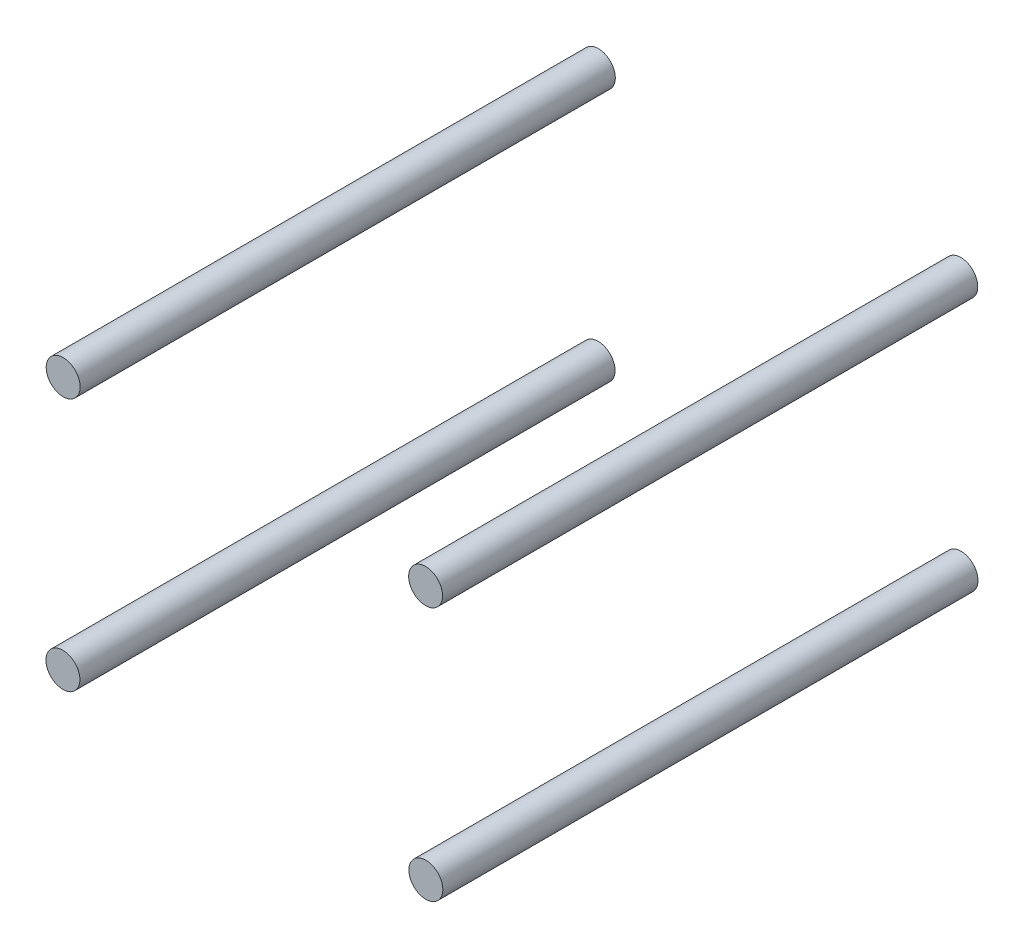
ISO-10303-21;
HEADER;
FILE_DESCRIPTION(('STEP AP214'),'2;1');
FILE_NAME('part.step','',(''),(''),'','','');
FILE_SCHEMA(('AUTOMOTIVE_DESIGN { 1 0 10303 214 1 1 1 1 }'));
ENDSEC;
DATA;
#1=APPLICATION_CONTEXT('core data for automotive mechanical design processes');
#2=APPLICATION_PROTOCOL_DEFINITION('international standard','automotive_design',2000,#1);
#3=PRODUCT_CONTEXT('',#1,'mechanical');
#4=PRODUCT('Part','Part','',(#3));
#5=PRODUCT_RELATED_PRODUCT_CATEGORY('part','',(#4));
#6=PRODUCT_DEFINITION_FORMATION('','',#4);
#7=PRODUCT_DEFINITION_CONTEXT('part definition',#1,'design');
#8=PRODUCT_DEFINITION('design','',#6,#7);
#9=PRODUCT_DEFINITION_SHAPE('','',#8);
#10=(LENGTH_UNIT() NAMED_UNIT(*) SI_UNIT(.MILLI.,.METRE.));
#11=(NAMED_UNIT(*) PLANE_ANGLE_UNIT() SI_UNIT($,.RADIAN.));
#12=(NAMED_UNIT(*) SI_UNIT($,.STERADIAN.) SOLID_ANGLE_UNIT());
#13=UNCERTAINTY_MEASURE_WITH_UNIT(LENGTH_MEASURE(1.E-05),#10,'distance_accuracy_value','');
#14=(GEOMETRIC_REPRESENTATION_CONTEXT(3) GLOBAL_UNCERTAINTY_ASSIGNED_CONTEXT((#13)) GLOBAL_UNIT_ASSIGNED_CONTEXT((#10,
#11,#12)) REPRESENTATION_CONTEXT('',''));
#15=CARTESIAN_POINT('',(0.,0.,0.));
#16=DIRECTION('',(0.,0.,1.));
#17=DIRECTION('',(1.,0.,0.));
#18=AXIS2_PLACEMENT_3D('',#15,#16,#17);
#19=CARTESIAN_POINT('',(6450.41638528545,3655.22893796991,92.11056));
#20=DIRECTION('',(0.,0.,-1.));
#21=DIRECTION('',(-1.,0.,0.));
#22=AXIS2_PLACEMENT_3D('',#19,#20,#21);
#23=CYLINDRICAL_SURFACE('',#22,2.92100002095541);
#24=CARTESIAN_POINT('',(6450.41638528545,3655.22893796991,92.11056));
#25=DIRECTION('',(0.,0.,1.));
#26=DIRECTION('',(1.,0.,0.));
#27=AXIS2_PLACEMENT_3D('',#24,#25,#26);
#28=CIRCLE('',#27,2.92100002095541);
#29=CARTESIAN_POINT('',(6453.33738530641,3655.22893796991,92.11056));
#30=VERTEX_POINT('',#29);
#31=EDGE_CURVE('E11',#30,#30,#28,.T.);
#32=ORIENTED_EDGE('',*,*,#31,.F.);
#33=EDGE_LOOP('',(#32));
#34=FACE_BOUND('',#33,.T.);
#35=CARTESIAN_POINT('',(6450.41638528545,3655.22893796991,0.));
#36=DIRECTION('',(0.,0.,1.));
#37=DIRECTION('',(1.,0.,0.));
#38=AXIS2_PLACEMENT_3D('',#35,#36,#37);
#39=CIRCLE('',#38,2.92100002095541);
#40=CARTESIAN_POINT('',(6453.33738530641,3655.22893796991,0.));
#41=VERTEX_POINT('',#40);
#42=EDGE_CURVE('E43',#41,#41,#39,.T.);
#43=ORIENTED_EDGE('',*,*,#42,.T.);
#44=EDGE_LOOP('',(#43));
#45=FACE_BOUND('',#44,.T.);
#46=ADVANCED_FACE('F40',(#34,#45),#23,.T.);
#47=CARTESIAN_POINT('',(6450.41638528545,3655.22893796991,92.11056));
#48=DIRECTION('',(0.,0.,1.));
#49=DIRECTION('',(1.,0.,0.));
#50=AXIS2_PLACEMENT_3D('',#47,#48,#49);
#51=PLANE('',#50);
#52=ORIENTED_EDGE('',*,*,#31,.T.);
#53=EDGE_LOOP('',(#52));
#54=FACE_BOUND('',#53,.T.);
#55=ADVANCED_FACE('F55',(#54),#51,.T.);
#56=CARTESIAN_POINT('',(6450.41638528545,3655.22893796991,0.));
#57=DIRECTION('',(0.,0.,1.));
#58=DIRECTION('',(1.,0.,0.));
#59=AXIS2_PLACEMENT_3D('',#56,#57,#58);
#60=PLANE('',#59);
#61=ORIENTED_EDGE('',*,*,#42,.F.);
#62=EDGE_LOOP('',(#61));
#63=FACE_BOUND('',#62,.T.);
#64=ADVANCED_FACE('F53',(#63),#60,.F.);
#65=CLOSED_SHELL('',(#46,#55,#64));
#66=MANIFOLD_SOLID_BREP('B2',#65);
#67=CARTESIAN_POINT('',(6512.79415839501,3655.28824749994,92.11056));
#68=DIRECTION('',(0.,0.,-1.));
#69=DIRECTION('',(-1.,0.,0.));
#70=AXIS2_PLACEMENT_3D('',#67,#68,#69);
#71=CYLINDRICAL_SURFACE('',#70,2.92100002095541);
#72=CARTESIAN_POINT('',(6512.79415839501,3655.28824749994,92.11056));
#73=DIRECTION('',(0.,0.,1.));
#74=DIRECTION('',(1.,0.,0.));
#75=AXIS2_PLACEMENT_3D('',#72,#73,#74);
#76=CIRCLE('',#75,2.92100002095541);
#77=CARTESIAN_POINT('',(6515.71515841596,3655.28824749994,92.11056));
#78=VERTEX_POINT('',#77);
#79=EDGE_CURVE('E39',#78,#78,#76,.T.);
#80=ORIENTED_EDGE('',*,*,#79,.F.);
#81=EDGE_LOOP('',(#80));
#82=FACE_BOUND('',#81,.T.);
#83=CARTESIAN_POINT('',(6512.79415839501,3655.28824749994,0.));
#84=DIRECTION('',(0.,0.,1.));
#85=DIRECTION('',(1.,0.,0.));
#86=AXIS2_PLACEMENT_3D('',#83,#84,#85);
#87=CIRCLE('',#86,2.92100002095541);
#88=CARTESIAN_POINT('',(6515.71515841596,3655.28824749994,0.));
#89=VERTEX_POINT('',#88);
#90=EDGE_CURVE('E92',#89,#89,#87,.T.);
#91=ORIENTED_EDGE('',*,*,#90,.T.);
#92=EDGE_LOOP('',(#91));
#93=FACE_BOUND('',#92,.T.);
#94=ADVANCED_FACE('F89',(#82,#93),#71,.T.);
#95=CARTESIAN_POINT('',(6512.79415839501,3655.28824749994,92.11056));
#96=DIRECTION('',(0.,0.,1.));
#97=DIRECTION('',(1.,0.,0.));
#98=AXIS2_PLACEMENT_3D('',#95,#96,#97);
#99=PLANE('',#98);
#100=ORIENTED_EDGE('',*,*,#79,.T.);
#101=EDGE_LOOP('',(#100));
#102=FACE_BOUND('',#101,.T.);
#103=ADVANCED_FACE('F104',(#102),#99,.T.);
#104=CARTESIAN_POINT('',(6512.79415839501,3655.28824749994,0.));
#105=DIRECTION('',(0.,0.,1.));
#106=DIRECTION('',(1.,0.,0.));
#107=AXIS2_PLACEMENT_3D('',#104,#105,#106);
#108=PLANE('',#107);
#109=ORIENTED_EDGE('',*,*,#90,.F.);
#110=EDGE_LOOP('',(#109));
#111=FACE_BOUND('',#110,.T.);
#112=ADVANCED_FACE('F102',(#111),#108,.F.);
#113=CLOSED_SHELL('',(#94,#103,#112));
#114=MANIFOLD_SOLID_BREP('B6',#113);
#115=CARTESIAN_POINT('',(6512.83577147224,3611.5224132315,92.11056));
#116=DIRECTION('',(0.,0.,-1.));
#117=DIRECTION('',(-1.,0.,0.));
#118=AXIS2_PLACEMENT_3D('',#115,#116,#117);
#119=CYLINDRICAL_SURFACE('',#118,2.92100002095541);
#120=CARTESIAN_POINT('',(6512.83577147224,3611.5224132315,92.11056));
#121=DIRECTION('',(0.,0.,1.));
#122=DIRECTION('',(1.,0.,0.));
#123=AXIS2_PLACEMENT_3D('',#120,#121,#122);
#124=CIRCLE('',#123,2.92100002095541);
#125=CARTESIAN_POINT('',(6515.7567714932,3611.5224132315,92.11056));
#126=VERTEX_POINT('',#125);
#127=EDGE_CURVE('E88',#126,#126,#124,.T.);
#128=ORIENTED_EDGE('',*,*,#127,.F.);
#129=EDGE_LOOP('',(#128));
#130=FACE_BOUND('',#129,.T.);
#131=CARTESIAN_POINT('',(6512.83577147224,3611.5224132315,0.));
#132=DIRECTION('',(0.,0.,1.));
#133=DIRECTION('',(1.,0.,0.));
#134=AXIS2_PLACEMENT_3D('',#131,#132,#133);
#135=CIRCLE('',#134,2.92100002095541);
#136=CARTESIAN_POINT('',(6515.7567714932,3611.5224132315,0.));
#137=VERTEX_POINT('',#136);
#138=EDGE_CURVE('E140',#137,#137,#135,.T.);
#139=ORIENTED_EDGE('',*,*,#138,.T.);
#140=EDGE_LOOP('',(#139));
#141=FACE_BOUND('',#140,.T.);
#142=ADVANCED_FACE('F137',(#130,#141),#119,.T.);
#143=CARTESIAN_POINT('',(6512.83577147224,3611.5224132315,92.11056));
#144=DIRECTION('',(0.,0.,1.));
#145=DIRECTION('',(1.,0.,0.));
#146=AXIS2_PLACEMENT_3D('',#143,#144,#145);
#147=PLANE('',#146);
#148=ORIENTED_EDGE('',*,*,#127,.T.);
#149=EDGE_LOOP('',(#148));
#150=FACE_BOUND('',#149,.T.);
#151=ADVANCED_FACE('F152',(#150),#147,.T.);
#152=CARTESIAN_POINT('',(6512.83577147224,3611.5224132315,0.));
#153=DIRECTION('',(0.,0.,1.));
#154=DIRECTION('',(1.,0.,0.));
#155=AXIS2_PLACEMENT_3D('',#152,#153,#154);
#156=PLANE('',#155);
#157=ORIENTED_EDGE('',*,*,#138,.F.);
#158=EDGE_LOOP('',(#157));
#159=FACE_BOUND('',#158,.T.);
#160=ADVANCED_FACE('F150',(#159),#156,.F.);
#161=CLOSED_SHELL('',(#142,#151,#160));
#162=MANIFOLD_SOLID_BREP('B34',#161);
#163=CARTESIAN_POINT('',(6450.37562813931,3611.58073630238,92.11056));
#164=DIRECTION('',(0.,0.,-1.));
#165=DIRECTION('',(-1.,0.,0.));
#166=AXIS2_PLACEMENT_3D('',#163,#164,#165);
#167=CYLINDRICAL_SURFACE('',#166,2.92100002095541);
#168=CARTESIAN_POINT('',(6450.37562813931,3611.58073630238,92.11056));
#169=DIRECTION('',(0.,0.,1.));
#170=DIRECTION('',(1.,0.,0.));
#171=AXIS2_PLACEMENT_3D('',#168,#169,#170);
#172=CIRCLE('',#171,2.92100002095541);
#173=CARTESIAN_POINT('',(6453.29662816027,3611.58073630238,92.11056));
#174=VERTEX_POINT('',#173);
#175=EDGE_CURVE('E136',#174,#174,#172,.T.);
#176=ORIENTED_EDGE('',*,*,#175,.F.);
#177=EDGE_LOOP('',(#176));
#178=FACE_BOUND('',#177,.T.);
#179=CARTESIAN_POINT('',(6450.37562813931,3611.58073630238,0.));
#180=DIRECTION('',(0.,0.,1.));
#181=DIRECTION('',(1.,0.,0.));
#182=AXIS2_PLACEMENT_3D('',#179,#180,#181);
#183=CIRCLE('',#182,2.92100002095541);
#184=CARTESIAN_POINT('',(6453.29662816027,3611.58073630238,0.));
#185=VERTEX_POINT('',#184);
#186=EDGE_CURVE('E181',#185,#185,#183,.T.);
#187=ORIENTED_EDGE('',*,*,#186,.T.);
#188=EDGE_LOOP('',(#187));
#189=FACE_BOUND('',#188,.T.);
#190=ADVANCED_FACE('F178',(#178,#189),#167,.T.);
#191=CARTESIAN_POINT('',(6450.37562813931,3611.58073630238,92.11056));
#192=DIRECTION('',(0.,0.,1.));
#193=DIRECTION('',(1.,0.,0.));
#194=AXIS2_PLACEMENT_3D('',#191,#192,#193);
#195=PLANE('',#194);
#196=ORIENTED_EDGE('',*,*,#175,.T.);
#197=EDGE_LOOP('',(#196));
#198=FACE_BOUND('',#197,.T.);
#199=ADVANCED_FACE('F193',(#198),#195,.T.);
#200=CARTESIAN_POINT('',(6450.37562813931,3611.58073630238,0.));
#201=DIRECTION('',(0.,0.,1.));
#202=DIRECTION('',(1.,0.,0.));
#203=AXIS2_PLACEMENT_3D('',#200,#201,#202);
#204=PLANE('',#203);
#205=ORIENTED_EDGE('',*,*,#186,.F.);
#206=EDGE_LOOP('',(#205));
#207=FACE_BOUND('',#206,.T.);
#208=ADVANCED_FACE('F191',(#207),#204,.F.);
#209=CLOSED_SHELL('',(#190,#199,#208));
#210=MANIFOLD_SOLID_BREP('B83',#209);
#211=ADVANCED_BREP_SHAPE_REPRESENTATION('',(#18,#66,#114,#162,#210),#14);
#212=SHAPE_DEFINITION_REPRESENTATION(#9,#211);
ENDSEC;
END-ISO-10303-21;
